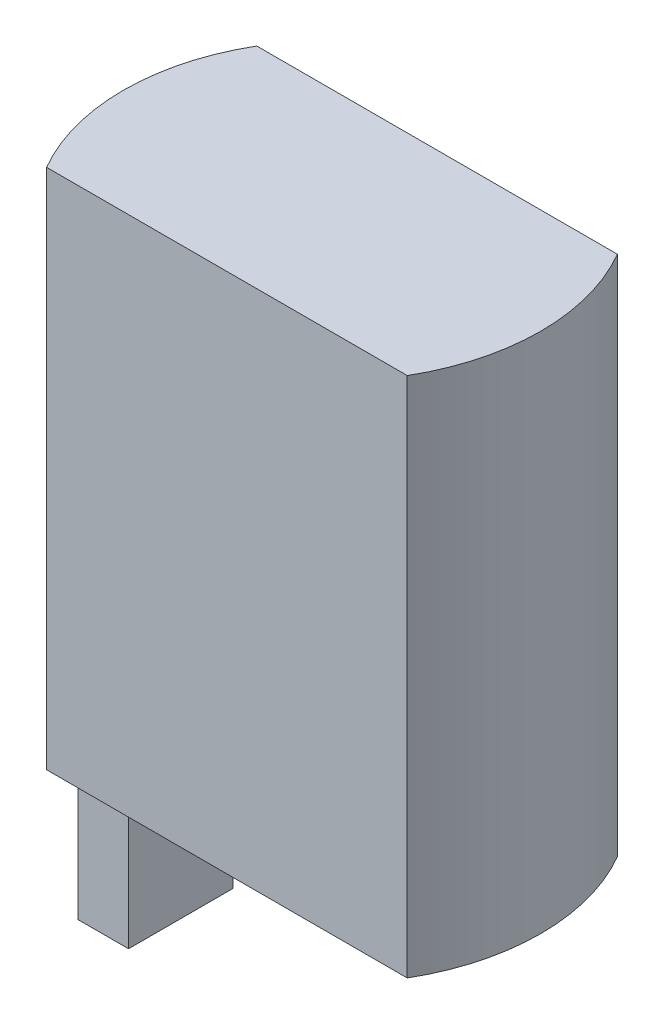
ISO-10303-21;
HEADER;
FILE_DESCRIPTION(('STEP AP214'),'2;1');
FILE_NAME('part.step','',(''),(''),'','','');
FILE_SCHEMA(('AUTOMOTIVE_DESIGN { 1 0 10303 214 1 1 1 1 }'));
ENDSEC;
DATA;
#1=APPLICATION_CONTEXT('core data for automotive mechanical design processes');
#2=APPLICATION_PROTOCOL_DEFINITION('international standard','automotive_design',2000,#1);
#3=PRODUCT_CONTEXT('',#1,'mechanical');
#4=PRODUCT('Part','Part','',(#3));
#5=PRODUCT_RELATED_PRODUCT_CATEGORY('part','',(#4));
#6=PRODUCT_DEFINITION_FORMATION('','',#4);
#7=PRODUCT_DEFINITION_CONTEXT('part definition',#1,'design');
#8=PRODUCT_DEFINITION('design','',#6,#7);
#9=PRODUCT_DEFINITION_SHAPE('','',#8);
#10=(LENGTH_UNIT() NAMED_UNIT(*) SI_UNIT(.MILLI.,.METRE.));
#11=(NAMED_UNIT(*) PLANE_ANGLE_UNIT() SI_UNIT($,.RADIAN.));
#12=(NAMED_UNIT(*) SI_UNIT($,.STERADIAN.) SOLID_ANGLE_UNIT());
#13=UNCERTAINTY_MEASURE_WITH_UNIT(LENGTH_MEASURE(1.E-05),#10,'distance_accuracy_value','');
#14=(GEOMETRIC_REPRESENTATION_CONTEXT(3) GLOBAL_UNCERTAINTY_ASSIGNED_CONTEXT((#13)) GLOBAL_UNIT_ASSIGNED_CONTEXT((#10,
#11,#12)) REPRESENTATION_CONTEXT('',''));
#15=CARTESIAN_POINT('',(0.,0.,0.));
#16=DIRECTION('',(0.,0.,1.));
#17=DIRECTION('',(1.,0.,0.));
#18=AXIS2_PLACEMENT_3D('',#15,#16,#17);
#19=CARTESIAN_POINT('',(-8.05,-8.,-2.5));
#20=DIRECTION('',(1.,0.,0.));
#21=DIRECTION('',(0.,0.,-1.));
#22=AXIS2_PLACEMENT_3D('',#19,#20,#21);
#23=PLANE('',#22);
#24=DIRECTION('',(0.,-1.,0.));
#25=VECTOR('',#24,1.);
#26=CARTESIAN_POINT('',(-8.05,-8.,1.5));
#27=LINE('',#26,#25);
#28=CARTESIAN_POINT('',(-8.05,-0.75,1.5));
#29=VERTEX_POINT('',#28);
#30=CARTESIAN_POINT('',(-8.05,-8.,1.5));
#31=VERTEX_POINT('',#30);
#32=EDGE_CURVE('E56',#29,#31,#27,.T.);
#33=ORIENTED_EDGE('',*,*,#32,.F.);
#34=DIRECTION('',(0.,0.,1.));
#35=VECTOR('',#34,1.);
#36=CARTESIAN_POINT('',(-8.05,-0.75,1.5));
#37=LINE('',#36,#35);
#38=CARTESIAN_POINT('',(-8.05,-0.75,-1.5));
#39=VERTEX_POINT('',#38);
#40=EDGE_CURVE('E344',#39,#29,#37,.T.);
#41=ORIENTED_EDGE('',*,*,#40,.F.);
#42=DIRECTION('',(0.,1.,0.));
#43=VECTOR('',#42,1.);
#44=CARTESIAN_POINT('',(-8.05,-0.75,-1.5));
#45=LINE('',#44,#43);
#46=CARTESIAN_POINT('',(-8.05,-8.,-1.5));
#47=VERTEX_POINT('',#46);
#48=EDGE_CURVE('E61',#47,#39,#45,.T.);
#49=ORIENTED_EDGE('',*,*,#48,.F.);
#50=DIRECTION('',(0.,0.,-1.));
#51=VECTOR('',#50,1.);
#52=CARTESIAN_POINT('',(-8.05,-8.,-2.5));
#53=LINE('',#52,#51);
#54=EDGE_CURVE('E155',#31,#47,#53,.T.);
#55=ORIENTED_EDGE('',*,*,#54,.F.);
#56=EDGE_LOOP('',(#33,#41,#49,#55));
#57=FACE_BOUND('',#56,.T.);
#58=ADVANCED_FACE('F41',(#57),#23,.F.);
#59=CARTESIAN_POINT('',(-8.05,-8.,-2.5));
#60=DIRECTION('',(0.,0.,1.));
#61=DIRECTION('',(1.,0.,0.));
#62=AXIS2_PLACEMENT_3D('',#59,#60,#61);
#63=PLANE('',#62);
#64=DIRECTION('',(1.,0.,0.));
#65=VECTOR('',#64,1.);
#66=CARTESIAN_POINT('',(-8.05,-8.,-2.5));
#67=LINE('',#66,#65);
#68=CARTESIAN_POINT('',(-9.68245836551854,-8.,-2.5));
#69=VERTEX_POINT('',#68);
#70=CARTESIAN_POINT('',(-7.25,-8.,-2.5));
#71=VERTEX_POINT('',#70);
#72=EDGE_CURVE('E145',#69,#71,#67,.T.);
#73=ORIENTED_EDGE('',*,*,#72,.F.);
#74=DIRECTION('',(0.,1.,0.));
#75=VECTOR('',#74,1.);
#76=CARTESIAN_POINT('',(-9.68245836551854,-8.001,-2.5));
#77=LINE('',#76,#75);
#78=CARTESIAN_POINT('',(-9.68245836551854,0.,-2.5));
#79=VERTEX_POINT('',#78);
#80=EDGE_CURVE('E128',#69,#79,#77,.T.);
#81=ORIENTED_EDGE('',*,*,#80,.T.);
#82=DIRECTION('',(1.,0.,0.));
#83=VECTOR('',#82,1.);
#84=CARTESIAN_POINT('',(-8.05,0.,-2.5));
#85=LINE('',#84,#83);
#86=CARTESIAN_POINT('',(-7.25,0.,-2.5));
#87=VERTEX_POINT('',#86);
#88=EDGE_CURVE('E166',#79,#87,#85,.T.);
#89=ORIENTED_EDGE('',*,*,#88,.T.);
#90=DIRECTION('',(0.,1.,0.));
#91=VECTOR('',#90,1.);
#92=CARTESIAN_POINT('',(-7.25,-8.,-2.5));
#93=LINE('',#92,#91);
#94=EDGE_CURVE('E11',#71,#87,#93,.T.);
#95=ORIENTED_EDGE('',*,*,#94,.F.);
#96=EDGE_LOOP('',(#73,#81,#89,#95));
#97=FACE_BOUND('',#96,.T.);
#98=ADVANCED_FACE('F151',(#97),#63,.F.);
#99=CARTESIAN_POINT('',(-7.25,-8.,-2.5));
#100=DIRECTION('',(-1.,0.,0.));
#101=DIRECTION('',(0.,0.,1.));
#102=AXIS2_PLACEMENT_3D('',#99,#100,#101);
#103=PLANE('',#102);
#104=DIRECTION('',(0.,0.,1.));
#105=VECTOR('',#104,1.);
#106=CARTESIAN_POINT('',(-7.25,0.,-2.5));
#107=LINE('',#106,#105);
#108=CARTESIAN_POINT('',(-7.25,0.,2.5));
#109=VERTEX_POINT('',#108);
#110=EDGE_CURVE('E169',#87,#109,#107,.T.);
#111=ORIENTED_EDGE('',*,*,#110,.T.);
#112=DIRECTION('',(0.,1.,0.));
#113=VECTOR('',#112,1.);
#114=CARTESIAN_POINT('',(-7.25,-8.,2.5));
#115=LINE('',#114,#113);
#116=CARTESIAN_POINT('',(-7.25,-8.,2.5));
#117=VERTEX_POINT('',#116);
#118=EDGE_CURVE('E49',#117,#109,#115,.T.);
#119=ORIENTED_EDGE('',*,*,#118,.F.);
#120=DIRECTION('',(0.,0.,1.));
#121=VECTOR('',#120,1.);
#122=CARTESIAN_POINT('',(-7.25,-8.,-2.5));
#123=LINE('',#122,#121);
#124=EDGE_CURVE('E154',#71,#117,#123,.T.);
#125=ORIENTED_EDGE('',*,*,#124,.F.);
#126=ORIENTED_EDGE('',*,*,#94,.T.);
#127=EDGE_LOOP('',(#111,#119,#125,#126));
#128=FACE_BOUND('',#127,.T.);
#129=ADVANCED_FACE('F247',(#128),#103,.F.);
#130=CARTESIAN_POINT('',(-8.05,-8.,2.5));
#131=DIRECTION('',(0.,0.,-1.));
#132=DIRECTION('',(-1.,0.,0.));
#133=AXIS2_PLACEMENT_3D('',#130,#131,#132);
#134=PLANE('',#133);
#135=DIRECTION('',(-1.,0.,0.));
#136=VECTOR('',#135,1.);
#137=CARTESIAN_POINT('',(-8.05,0.,2.5));
#138=LINE('',#137,#136);
#139=CARTESIAN_POINT('',(-9.68245836551854,0.,2.5));
#140=VERTEX_POINT('',#139);
#141=EDGE_CURVE('E160',#109,#140,#138,.T.);
#142=ORIENTED_EDGE('',*,*,#141,.T.);
#143=DIRECTION('',(0.,1.,0.));
#144=VECTOR('',#143,1.);
#145=CARTESIAN_POINT('',(-9.68245836551854,-8.001,2.5));
#146=LINE('',#145,#144);
#147=CARTESIAN_POINT('',(-9.68245836551854,-8.,2.5));
#148=VERTEX_POINT('',#147);
#149=EDGE_CURVE('E140',#148,#140,#146,.T.);
#150=ORIENTED_EDGE('',*,*,#149,.F.);
#151=DIRECTION('',(-1.,0.,0.));
#152=VECTOR('',#151,1.);
#153=CARTESIAN_POINT('',(-8.05,-8.,2.5));
#154=LINE('',#153,#152);
#155=EDGE_CURVE('E148',#117,#148,#154,.T.);
#156=ORIENTED_EDGE('',*,*,#155,.F.);
#157=ORIENTED_EDGE('',*,*,#118,.T.);
#158=EDGE_LOOP('',(#142,#150,#156,#157));
#159=FACE_BOUND('',#158,.T.);
#160=ADVANCED_FACE('F180',(#159),#134,.F.);
#161=CARTESIAN_POINT('',(0.,-8.,0.));
#162=DIRECTION('',(0.,1.,0.));
#163=DIRECTION('',(0.,0.,1.));
#164=AXIS2_PLACEMENT_3D('',#161,#162,#163);
#165=PLANE('',#164);
#166=DIRECTION('',(1.,0.,0.));
#167=VECTOR('',#166,1.);
#168=CARTESIAN_POINT('',(-9.25,-8.,-1.5));
#169=LINE('',#168,#167);
#170=CARTESIAN_POINT('',(-9.25,-8.,-1.5));
#171=VERTEX_POINT('',#170);
#172=EDGE_CURVE('E170',#171,#47,#169,.T.);
#173=ORIENTED_EDGE('',*,*,#172,.F.);
#174=DIRECTION('',(0.,0.,1.));
#175=VECTOR('',#174,1.);
#176=CARTESIAN_POINT('',(-9.25,-8.,-2.5));
#177=LINE('',#176,#175);
#178=CARTESIAN_POINT('',(-9.25,-8.,1.5));
#179=VERTEX_POINT('',#178);
#180=EDGE_CURVE('E217',#171,#179,#177,.T.);
#181=ORIENTED_EDGE('',*,*,#180,.T.);
#182=DIRECTION('',(1.,0.,0.));
#183=VECTOR('',#182,1.);
#184=CARTESIAN_POINT('',(-9.25,-8.,1.5));
#185=LINE('',#184,#183);
#186=EDGE_CURVE('E355',#179,#31,#185,.T.);
#187=ORIENTED_EDGE('',*,*,#186,.T.);
#188=ORIENTED_EDGE('',*,*,#54,.T.);
#189=EDGE_LOOP('',(#173,#181,#187,#188));
#190=FACE_BOUND('',#189,.T.);
#191=ORIENTED_EDGE('',*,*,#155,.T.);
#192=CARTESIAN_POINT('',(0.,-8.,0.));
#193=DIRECTION('',(0.,1.,0.));
#194=DIRECTION('',(0.,0.,1.));
#195=AXIS2_PLACEMENT_3D('',#192,#193,#194);
#196=CIRCLE('',#195,10.);
#197=EDGE_CURVE('E132',#69,#148,#196,.T.);
#198=ORIENTED_EDGE('',*,*,#197,.F.);
#199=ORIENTED_EDGE('',*,*,#72,.T.);
#200=ORIENTED_EDGE('',*,*,#124,.T.);
#201=EDGE_LOOP('',(#191,#198,#199,#200));
#202=FACE_BOUND('',#201,.T.);
#203=ADVANCED_FACE('F144',(#190,#202),#165,.F.);
#204=CARTESIAN_POINT('',(-9.25,-0.75,-1.5));
#205=DIRECTION('',(0.,0.,-1.));
#206=DIRECTION('',(0.,1.,0.));
#207=AXIS2_PLACEMENT_3D('',#204,#205,#206);
#208=PLANE('',#207);
#209=ORIENTED_EDGE('',*,*,#48,.T.);
#210=DIRECTION('',(1.,0.,0.));
#211=VECTOR('',#210,1.);
#212=CARTESIAN_POINT('',(-9.25,-0.75,-1.5));
#213=LINE('',#212,#211);
#214=CARTESIAN_POINT('',(-9.25,-0.75,-1.5));
#215=VERTEX_POINT('',#214);
#216=EDGE_CURVE('E340',#215,#39,#213,.T.);
#217=ORIENTED_EDGE('',*,*,#216,.F.);
#218=DIRECTION('',(0.,1.,0.));
#219=VECTOR('',#218,1.);
#220=CARTESIAN_POINT('',(-9.25,-0.75,-1.5));
#221=LINE('',#220,#219);
#222=EDGE_CURVE('E364',#171,#215,#221,.T.);
#223=ORIENTED_EDGE('',*,*,#222,.F.);
#224=ORIENTED_EDGE('',*,*,#172,.T.);
#225=EDGE_LOOP('',(#209,#217,#223,#224));
#226=FACE_BOUND('',#225,.T.);
#227=ADVANCED_FACE('F284',(#226),#208,.F.);
#228=CARTESIAN_POINT('',(-9.25,-0.75,1.5));
#229=DIRECTION('',(0.,1.,0.));
#230=DIRECTION('',(0.,0.,1.));
#231=AXIS2_PLACEMENT_3D('',#228,#229,#230);
#232=PLANE('',#231);
#233=ORIENTED_EDGE('',*,*,#40,.T.);
#234=DIRECTION('',(1.,0.,0.));
#235=VECTOR('',#234,1.);
#236=CARTESIAN_POINT('',(-9.25,-0.75,1.5));
#237=LINE('',#236,#235);
#238=CARTESIAN_POINT('',(-9.25,-0.75,1.5));
#239=VERTEX_POINT('',#238);
#240=EDGE_CURVE('E351',#239,#29,#237,.T.);
#241=ORIENTED_EDGE('',*,*,#240,.F.);
#242=DIRECTION('',(0.,0.,1.));
#243=VECTOR('',#242,1.);
#244=CARTESIAN_POINT('',(-9.25,-0.75,1.5));
#245=LINE('',#244,#243);
#246=EDGE_CURVE('E348',#215,#239,#245,.T.);
#247=ORIENTED_EDGE('',*,*,#246,.F.);
#248=ORIENTED_EDGE('',*,*,#216,.T.);
#249=EDGE_LOOP('',(#233,#241,#247,#248));
#250=FACE_BOUND('',#249,.T.);
#251=ADVANCED_FACE('F330',(#250),#232,.F.);
#252=CARTESIAN_POINT('',(-9.25,-8.,1.5));
#253=DIRECTION('',(0.,0.,1.));
#254=DIRECTION('',(1.,0.,0.));
#255=AXIS2_PLACEMENT_3D('',#252,#253,#254);
#256=PLANE('',#255);
#257=ORIENTED_EDGE('',*,*,#32,.T.);
#258=ORIENTED_EDGE('',*,*,#186,.F.);
#259=DIRECTION('',(0.,-1.,0.));
#260=VECTOR('',#259,1.);
#261=CARTESIAN_POINT('',(-9.25,-8.,1.5));
#262=LINE('',#261,#260);
#263=EDGE_CURVE('E361',#239,#179,#262,.T.);
#264=ORIENTED_EDGE('',*,*,#263,.F.);
#265=ORIENTED_EDGE('',*,*,#240,.T.);
#266=EDGE_LOOP('',(#257,#258,#264,#265));
#267=FACE_BOUND('',#266,.T.);
#268=ADVANCED_FACE('F326',(#267),#256,.F.);
#269=CARTESIAN_POINT('',(-9.25,0.,0.));
#270=DIRECTION('',(1.,0.,0.));
#271=DIRECTION('',(0.,0.,-1.));
#272=AXIS2_PLACEMENT_3D('',#269,#270,#271);
#273=PLANE('',#272);
#274=ORIENTED_EDGE('',*,*,#180,.F.);
#275=ORIENTED_EDGE('',*,*,#222,.T.);
#276=ORIENTED_EDGE('',*,*,#246,.T.);
#277=ORIENTED_EDGE('',*,*,#263,.T.);
#278=EDGE_LOOP('',(#274,#275,#276,#277));
#279=FACE_BOUND('',#278,.T.);
#280=ADVANCED_FACE('F323',(#279),#273,.T.);
#281=CARTESIAN_POINT('',(0.,25.,0.));
#282=DIRECTION('',(0.,-1.,0.));
#283=DIRECTION('',(0.,0.,-1.));
#284=AXIS2_PLACEMENT_3D('',#281,#282,#283);
#285=CYLINDRICAL_SURFACE('',#284,10.);
#286=DIRECTION('',(0.,-1.,0.));
#287=VECTOR('',#286,1.);
#288=CARTESIAN_POINT('',(8.64,25.,-5.03491807281906));
#289=LINE('',#288,#287);
#290=CARTESIAN_POINT('',(8.64,25.,-5.03491807281906));
#291=VERTEX_POINT('',#290);
#292=CARTESIAN_POINT('',(8.64,0.,-5.03491807281906));
#293=VERTEX_POINT('',#292);
#294=EDGE_CURVE('E193',#291,#293,#289,.T.);
#295=ORIENTED_EDGE('',*,*,#294,.F.);
#296=CARTESIAN_POINT('',(0.,25.,0.));
#297=DIRECTION('',(0.,1.,0.));
#298=DIRECTION('',(0.,0.,1.));
#299=AXIS2_PLACEMENT_3D('',#296,#297,#298);
#300=CIRCLE('',#299,10.);
#301=CARTESIAN_POINT('',(8.64000000000001,25.,5.03491807281905));
#302=VERTEX_POINT('',#301);
#303=EDGE_CURVE('E210',#302,#291,#300,.T.);
#304=ORIENTED_EDGE('',*,*,#303,.F.);
#305=DIRECTION('',(0.,-1.,0.));
#306=VECTOR('',#305,1.);
#307=CARTESIAN_POINT('',(8.64000000000001,25.,5.03491807281905));
#308=LINE('',#307,#306);
#309=CARTESIAN_POINT('',(8.64000000000001,0.,5.03491807281905));
#310=VERTEX_POINT('',#309);
#311=EDGE_CURVE('E222',#302,#310,#308,.T.);
#312=ORIENTED_EDGE('',*,*,#311,.T.);
#313=CARTESIAN_POINT('',(0.,0.,0.));
#314=DIRECTION('',(0.,1.,0.));
#315=DIRECTION('',(0.,0.,1.));
#316=AXIS2_PLACEMENT_3D('',#313,#314,#315);
#317=CIRCLE('',#316,10.);
#318=EDGE_CURVE('E195',#310,#293,#317,.T.);
#319=ORIENTED_EDGE('',*,*,#318,.T.);
#320=EDGE_LOOP('',(#295,#304,#312,#319));
#321=FACE_BOUND('',#320,.T.);
#322=ADVANCED_FACE('F243',(#321),#285,.T.);
#323=DIRECTION('',(0.,-1.,0.));
#324=VECTOR('',#323,1.);
#325=CARTESIAN_POINT('',(-8.64,25.,-5.03491807281906));
#326=LINE('',#325,#324);
#327=CARTESIAN_POINT('',(-8.64,25.,-5.03491807281906));
#328=VERTEX_POINT('',#327);
#329=CARTESIAN_POINT('',(-8.64,0.,-5.03491807281906));
#330=VERTEX_POINT('',#329);
#331=EDGE_CURVE('E198',#328,#330,#326,.T.);
#332=ORIENTED_EDGE('',*,*,#331,.T.);
#333=EDGE_CURVE('E135',#330,#79,#317,.T.);
#334=ORIENTED_EDGE('',*,*,#333,.T.);
#335=ORIENTED_EDGE('',*,*,#80,.F.);
#336=ORIENTED_EDGE('',*,*,#197,.T.);
#337=ORIENTED_EDGE('',*,*,#149,.T.);
#338=CARTESIAN_POINT('',(-8.64000000000001,0.,5.03491807281905));
#339=VERTEX_POINT('',#338);
#340=EDGE_CURVE('E187',#140,#339,#317,.T.);
#341=ORIENTED_EDGE('',*,*,#340,.T.);
#342=DIRECTION('',(0.,-1.,0.));
#343=VECTOR('',#342,1.);
#344=CARTESIAN_POINT('',(-8.64000000000001,25.,5.03491807281905));
#345=LINE('',#344,#343);
#346=CARTESIAN_POINT('',(-8.64000000000001,25.,5.03491807281905));
#347=VERTEX_POINT('',#346);
#348=EDGE_CURVE('E226',#347,#339,#345,.T.);
#349=ORIENTED_EDGE('',*,*,#348,.F.);
#350=EDGE_CURVE('E204',#328,#347,#300,.T.);
#351=ORIENTED_EDGE('',*,*,#350,.F.);
#352=EDGE_LOOP('',(#332,#334,#335,#336,#337,#341,#349,#351));
#353=FACE_BOUND('',#352,.T.);
#354=ADVANCED_FACE('F131',(#353),#285,.T.);
#355=CARTESIAN_POINT('',(0.,25.,0.));
#356=DIRECTION('',(0.,1.,0.));
#357=DIRECTION('',(0.,0.,1.));
#358=AXIS2_PLACEMENT_3D('',#355,#356,#357);
#359=PLANE('',#358);
#360=ORIENTED_EDGE('',*,*,#303,.T.);
#361=DIRECTION('',(1.,0.,0.));
#362=VECTOR('',#361,1.);
#363=CARTESIAN_POINT('',(-8.64,25.,-5.03491807281906));
#364=LINE('',#363,#362);
#365=EDGE_CURVE('E233',#328,#291,#364,.T.);
#366=ORIENTED_EDGE('',*,*,#365,.F.);
#367=ORIENTED_EDGE('',*,*,#350,.T.);
#368=DIRECTION('',(1.,0.,0.));
#369=VECTOR('',#368,1.);
#370=CARTESIAN_POINT('',(-8.64,25.,5.03491807281905));
#371=LINE('',#370,#369);
#372=EDGE_CURVE('E219',#347,#302,#371,.T.);
#373=ORIENTED_EDGE('',*,*,#372,.T.);
#374=EDGE_LOOP('',(#360,#366,#367,#373));
#375=FACE_BOUND('',#374,.T.);
#376=ADVANCED_FACE('F244',(#375),#359,.T.);
#377=CARTESIAN_POINT('',(0.,0.,0.));
#378=DIRECTION('',(0.,1.,0.));
#379=DIRECTION('',(0.,0.,1.));
#380=AXIS2_PLACEMENT_3D('',#377,#378,#379);
#381=PLANE('',#380);
#382=ORIENTED_EDGE('',*,*,#88,.F.);
#383=ORIENTED_EDGE('',*,*,#333,.F.);
#384=DIRECTION('',(1.,0.,0.));
#385=VECTOR('',#384,1.);
#386=CARTESIAN_POINT('',(-8.64,0.,-5.03491807281906));
#387=LINE('',#386,#385);
#388=EDGE_CURVE('E225',#330,#293,#387,.T.);
#389=ORIENTED_EDGE('',*,*,#388,.T.);
#390=ORIENTED_EDGE('',*,*,#318,.F.);
#391=DIRECTION('',(1.,0.,0.));
#392=VECTOR('',#391,1.);
#393=CARTESIAN_POINT('',(-8.64,0.,5.03491807281905));
#394=LINE('',#393,#392);
#395=EDGE_CURVE('E189',#339,#310,#394,.T.);
#396=ORIENTED_EDGE('',*,*,#395,.F.);
#397=ORIENTED_EDGE('',*,*,#340,.F.);
#398=ORIENTED_EDGE('',*,*,#141,.F.);
#399=ORIENTED_EDGE('',*,*,#110,.F.);
#400=EDGE_LOOP('',(#382,#383,#389,#390,#396,#397,#398,#399));
#401=FACE_BOUND('',#400,.T.);
#402=ADVANCED_FACE('F185',(#401),#381,.F.);
#403=CARTESIAN_POINT('',(-8.64,25.,5.03491807281905));
#404=DIRECTION('',(0.,0.,-1.));
#405=DIRECTION('',(-1.,0.,0.));
#406=AXIS2_PLACEMENT_3D('',#403,#404,#405);
#407=PLANE('',#406);
#408=ORIENTED_EDGE('',*,*,#395,.T.);
#409=ORIENTED_EDGE('',*,*,#311,.F.);
#410=ORIENTED_EDGE('',*,*,#372,.F.);
#411=ORIENTED_EDGE('',*,*,#348,.T.);
#412=EDGE_LOOP('',(#408,#409,#410,#411));
#413=FACE_BOUND('',#412,.T.);
#414=ADVANCED_FACE('F246',(#413),#407,.F.);
#415=CARTESIAN_POINT('',(-8.64,25.,-5.03491807281906));
#416=DIRECTION('',(0.,0.,-1.));
#417=DIRECTION('',(-1.,0.,0.));
#418=AXIS2_PLACEMENT_3D('',#415,#416,#417);
#419=PLANE('',#418);
#420=ORIENTED_EDGE('',*,*,#388,.F.);
#421=ORIENTED_EDGE('',*,*,#331,.F.);
#422=ORIENTED_EDGE('',*,*,#365,.T.);
#423=ORIENTED_EDGE('',*,*,#294,.T.);
#424=EDGE_LOOP('',(#420,#421,#422,#423));
#425=FACE_BOUND('',#424,.T.);
#426=ADVANCED_FACE('F241',(#425),#419,.T.);
#427=CLOSED_SHELL('',(#58,#98,#129,#160,#203,#227,#251,#268,#280,#322,#354,#376,#402,#414,#426));
#428=MANIFOLD_SOLID_BREP('B2',#427);
#429=ADVANCED_BREP_SHAPE_REPRESENTATION('',(#18,#428),#14);
#430=SHAPE_DEFINITION_REPRESENTATION(#9,#429);
ENDSEC;
END-ISO-10303-21;
